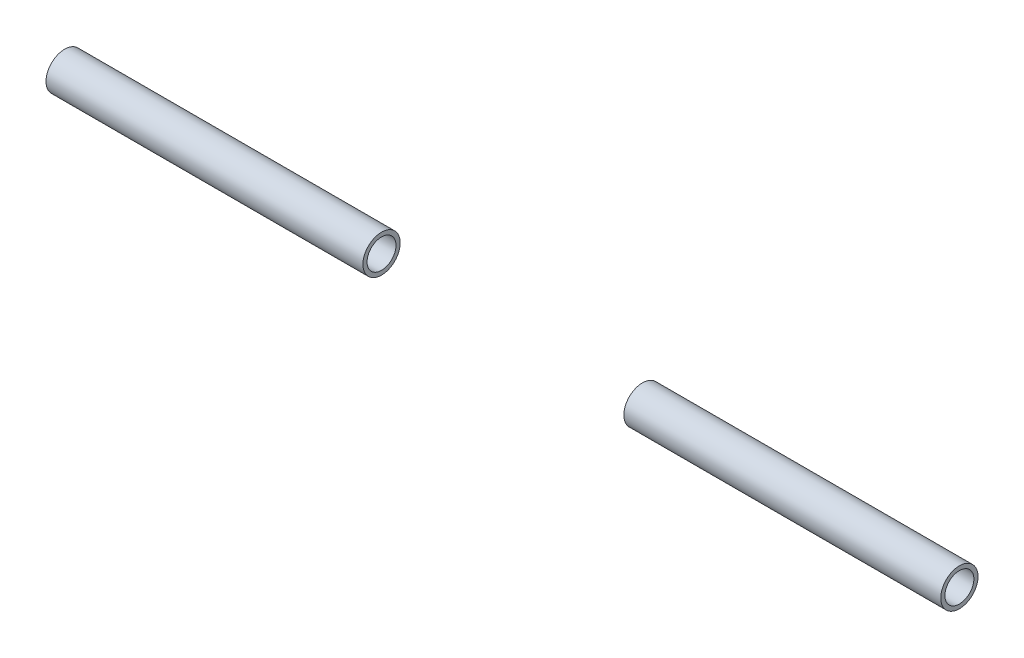
ISO-10303-21;
HEADER;
FILE_DESCRIPTION(('STEP AP214'),'2;1');
FILE_NAME('part.step','',(''),(''),'','','');
FILE_SCHEMA(('AUTOMOTIVE_DESIGN { 1 0 10303 214 1 1 1 1 }'));
ENDSEC;
DATA;
#1=APPLICATION_CONTEXT('core data for automotive mechanical design processes');
#2=APPLICATION_PROTOCOL_DEFINITION('international standard','automotive_design',2000,#1);
#3=PRODUCT_CONTEXT('',#1,'mechanical');
#4=PRODUCT('Part','Part','',(#3));
#5=PRODUCT_RELATED_PRODUCT_CATEGORY('part','',(#4));
#6=PRODUCT_DEFINITION_FORMATION('','',#4);
#7=PRODUCT_DEFINITION_CONTEXT('part definition',#1,'design');
#8=PRODUCT_DEFINITION('design','',#6,#7);
#9=PRODUCT_DEFINITION_SHAPE('','',#8);
#10=(LENGTH_UNIT() NAMED_UNIT(*) SI_UNIT(.MILLI.,.METRE.));
#11=(NAMED_UNIT(*) PLANE_ANGLE_UNIT() SI_UNIT($,.RADIAN.));
#12=(NAMED_UNIT(*) SI_UNIT($,.STERADIAN.) SOLID_ANGLE_UNIT());
#13=UNCERTAINTY_MEASURE_WITH_UNIT(LENGTH_MEASURE(1.E-05),#10,'distance_accuracy_value','');
#14=(GEOMETRIC_REPRESENTATION_CONTEXT(3) GLOBAL_UNCERTAINTY_ASSIGNED_CONTEXT((#13)) GLOBAL_UNIT_ASSIGNED_CONTEXT((#10,
#11,#12)) REPRESENTATION_CONTEXT('',''));
#15=CARTESIAN_POINT('',(0.,0.,0.));
#16=DIRECTION('',(0.,0.,1.));
#17=DIRECTION('',(1.,0.,0.));
#18=AXIS2_PLACEMENT_3D('',#15,#16,#17);
#19=CARTESIAN_POINT('',(-76.2,0.,0.));
#20=DIRECTION('',(-1.,0.,0.));
#21=DIRECTION('',(0.,0.,1.));
#22=AXIS2_PLACEMENT_3D('',#19,#20,#21);
#23=CYLINDRICAL_SURFACE('',#22,2.4638);
#24=CARTESIAN_POINT('',(22.225,0.,0.));
#25=DIRECTION('',(1.,0.,0.));
#26=DIRECTION('',(0.,0.,-1.));
#27=AXIS2_PLACEMENT_3D('',#24,#25,#26);
#28=CIRCLE('',#27,2.4638);
#29=CARTESIAN_POINT('',(22.225,0.,-2.4638));
#30=VERTEX_POINT('',#29);
#31=EDGE_CURVE('E49',#30,#30,#28,.F.);
#32=ORIENTED_EDGE('',*,*,#31,.T.);
#33=EDGE_LOOP('',(#32));
#34=FACE_BOUND('',#33,.T.);
#35=CARTESIAN_POINT('',(76.2,0.,0.));
#36=DIRECTION('',(-1.,0.,0.));
#37=DIRECTION('',(0.,0.,1.));
#38=AXIS2_PLACEMENT_3D('',#35,#36,#37);
#39=CIRCLE('',#38,2.4638);
#40=CARTESIAN_POINT('',(76.2,0.,2.4638));
#41=VERTEX_POINT('',#40);
#42=EDGE_CURVE('E11',#41,#41,#39,.T.);
#43=ORIENTED_EDGE('',*,*,#42,.F.);
#44=EDGE_LOOP('',(#43));
#45=FACE_BOUND('',#44,.T.);
#46=ADVANCED_FACE('F45',(#34,#45),#23,.F.);
#47=CARTESIAN_POINT('',(-76.2,0.,0.));
#48=DIRECTION('',(-1.,0.,0.));
#49=DIRECTION('',(0.,0.,1.));
#50=AXIS2_PLACEMENT_3D('',#47,#48,#49);
#51=CYLINDRICAL_SURFACE('',#50,3.175);
#52=CARTESIAN_POINT('',(76.2,0.,0.));
#53=DIRECTION('',(-1.,0.,0.));
#54=DIRECTION('',(0.,0.,1.));
#55=AXIS2_PLACEMENT_3D('',#52,#53,#54);
#56=CIRCLE('',#55,3.175);
#57=CARTESIAN_POINT('',(76.2,0.,3.175));
#58=VERTEX_POINT('',#57);
#59=EDGE_CURVE('E58',#58,#58,#56,.T.);
#60=ORIENTED_EDGE('',*,*,#59,.T.);
#61=EDGE_LOOP('',(#60));
#62=FACE_BOUND('',#61,.T.);
#63=CARTESIAN_POINT('',(22.225,0.,0.));
#64=DIRECTION('',(1.,0.,0.));
#65=DIRECTION('',(0.,0.,-1.));
#66=AXIS2_PLACEMENT_3D('',#63,#64,#65);
#67=CIRCLE('',#66,3.175);
#68=CARTESIAN_POINT('',(22.225,0.,-3.175));
#69=VERTEX_POINT('',#68);
#70=EDGE_CURVE('E53',#69,#69,#67,.T.);
#71=ORIENTED_EDGE('',*,*,#70,.T.);
#72=EDGE_LOOP('',(#71));
#73=FACE_BOUND('',#72,.T.);
#74=ADVANCED_FACE('F47',(#62,#73),#51,.T.);
#75=CARTESIAN_POINT('',(76.2,3.175,0.));
#76=DIRECTION('',(-1.,0.,0.));
#77=DIRECTION('',(0.,0.,1.));
#78=AXIS2_PLACEMENT_3D('',#75,#76,#77);
#79=PLANE('',#78);
#80=ORIENTED_EDGE('',*,*,#59,.F.);
#81=EDGE_LOOP('',(#80));
#82=FACE_BOUND('',#81,.T.);
#83=ORIENTED_EDGE('',*,*,#42,.T.);
#84=EDGE_LOOP('',(#83));
#85=FACE_BOUND('',#84,.T.);
#86=ADVANCED_FACE('F70',(#82,#85),#79,.F.);
#87=CARTESIAN_POINT('',(22.225,-22.225,-3.175));
#88=DIRECTION('',(1.,0.,0.));
#89=DIRECTION('',(0.,0.,-1.));
#90=AXIS2_PLACEMENT_3D('',#87,#88,#89);
#91=PLANE('',#90);
#92=ORIENTED_EDGE('',*,*,#70,.F.);
#93=EDGE_LOOP('',(#92));
#94=FACE_BOUND('',#93,.T.);
#95=ORIENTED_EDGE('',*,*,#31,.F.);
#96=EDGE_LOOP('',(#95));
#97=FACE_BOUND('',#96,.T.);
#98=ADVANCED_FACE('F68',(#94,#97),#91,.F.);
#99=CLOSED_SHELL('',(#46,#74,#86,#98));
#100=MANIFOLD_SOLID_BREP('B2',#99);
#101=CARTESIAN_POINT('',(-76.2,0.,0.));
#102=DIRECTION('',(-1.,0.,0.));
#103=DIRECTION('',(0.,0.,1.));
#104=AXIS2_PLACEMENT_3D('',#101,#102,#103);
#105=CYLINDRICAL_SURFACE('',#104,2.4638);
#106=CARTESIAN_POINT('',(-22.225,0.,0.));
#107=DIRECTION('',(-1.,0.,0.));
#108=DIRECTION('',(0.,0.,1.));
#109=AXIS2_PLACEMENT_3D('',#106,#107,#108);
#110=CIRCLE('',#109,2.4638);
#111=CARTESIAN_POINT('',(-22.225,0.,2.4638));
#112=VERTEX_POINT('',#111);
#113=EDGE_CURVE('E122',#112,#112,#110,.F.);
#114=ORIENTED_EDGE('',*,*,#113,.T.);
#115=EDGE_LOOP('',(#114));
#116=FACE_BOUND('',#115,.T.);
#117=CARTESIAN_POINT('',(-76.2,0.,0.));
#118=DIRECTION('',(-1.,0.,0.));
#119=DIRECTION('',(0.,0.,1.));
#120=AXIS2_PLACEMENT_3D('',#117,#118,#119);
#121=CIRCLE('',#120,2.4638);
#122=CARTESIAN_POINT('',(-76.2,0.,2.4638));
#123=VERTEX_POINT('',#122);
#124=EDGE_CURVE('E114',#123,#123,#121,.T.);
#125=ORIENTED_EDGE('',*,*,#124,.T.);
#126=EDGE_LOOP('',(#125));
#127=FACE_BOUND('',#126,.T.);
#128=ADVANCED_FACE('F107',(#116,#127),#105,.F.);
#129=CARTESIAN_POINT('',(-76.2,3.175,0.));
#130=DIRECTION('',(1.,0.,0.));
#131=DIRECTION('',(0.,0.,-1.));
#132=AXIS2_PLACEMENT_3D('',#129,#130,#131);
#133=PLANE('',#132);
#134=ORIENTED_EDGE('',*,*,#124,.F.);
#135=EDGE_LOOP('',(#134));
#136=FACE_BOUND('',#135,.T.);
#137=CARTESIAN_POINT('',(-76.2,0.,0.));
#138=DIRECTION('',(-1.,0.,0.));
#139=DIRECTION('',(0.,0.,1.));
#140=AXIS2_PLACEMENT_3D('',#137,#138,#139);
#141=CIRCLE('',#140,3.175);
#142=CARTESIAN_POINT('',(-76.2,0.,3.175));
#143=VERTEX_POINT('',#142);
#144=EDGE_CURVE('E118',#143,#143,#141,.T.);
#145=ORIENTED_EDGE('',*,*,#144,.T.);
#146=EDGE_LOOP('',(#145));
#147=FACE_BOUND('',#146,.T.);
#148=ADVANCED_FACE('F109',(#136,#147),#133,.F.);
#149=CARTESIAN_POINT('',(-76.2,0.,0.));
#150=DIRECTION('',(-1.,0.,0.));
#151=DIRECTION('',(0.,0.,1.));
#152=AXIS2_PLACEMENT_3D('',#149,#150,#151);
#153=CYLINDRICAL_SURFACE('',#152,3.175);
#154=CARTESIAN_POINT('',(-22.225,0.,0.));
#155=DIRECTION('',(-1.,0.,0.));
#156=DIRECTION('',(0.,0.,1.));
#157=AXIS2_PLACEMENT_3D('',#154,#155,#156);
#158=CIRCLE('',#157,3.175);
#159=CARTESIAN_POINT('',(-22.225,0.,3.175));
#160=VERTEX_POINT('',#159);
#161=EDGE_CURVE('E44',#160,#160,#158,.T.);
#162=ORIENTED_EDGE('',*,*,#161,.T.);
#163=EDGE_LOOP('',(#162));
#164=FACE_BOUND('',#163,.T.);
#165=ORIENTED_EDGE('',*,*,#144,.F.);
#166=EDGE_LOOP('',(#165));
#167=FACE_BOUND('',#166,.T.);
#168=ADVANCED_FACE('F131',(#164,#167),#153,.T.);
#169=CARTESIAN_POINT('',(-22.225,-22.225,-3.175));
#170=DIRECTION('',(-1.,0.,0.));
#171=DIRECTION('',(0.,0.,1.));
#172=AXIS2_PLACEMENT_3D('',#169,#170,#171);
#173=PLANE('',#172);
#174=ORIENTED_EDGE('',*,*,#161,.F.);
#175=EDGE_LOOP('',(#174));
#176=FACE_BOUND('',#175,.T.);
#177=ORIENTED_EDGE('',*,*,#113,.F.);
#178=EDGE_LOOP('',(#177));
#179=FACE_BOUND('',#178,.T.);
#180=ADVANCED_FACE('F129',(#176,#179),#173,.F.);
#181=CLOSED_SHELL('',(#128,#148,#168,#180));
#182=MANIFOLD_SOLID_BREP('B6',#181);
#183=ADVANCED_BREP_SHAPE_REPRESENTATION('',(#18,#100,#182),#14);
#184=SHAPE_DEFINITION_REPRESENTATION(#9,#183);
ENDSEC;
END-ISO-10303-21;
